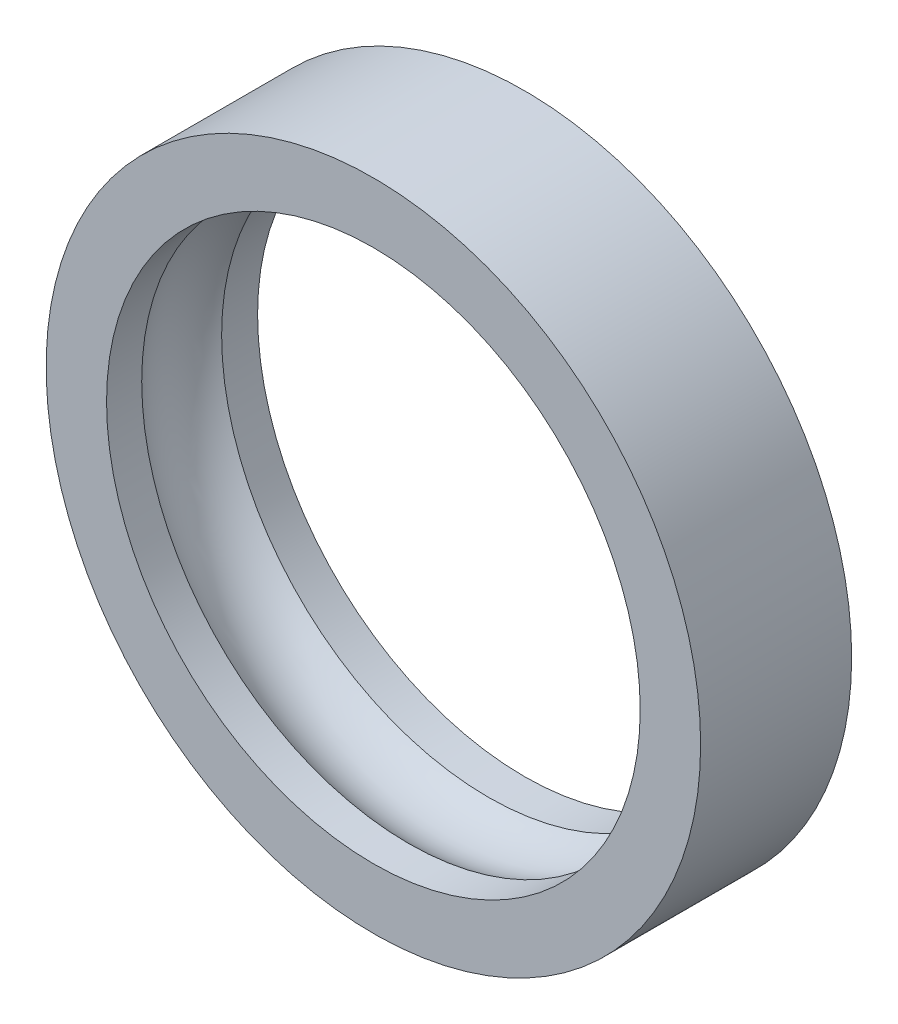
ISO-10303-21;
HEADER;
FILE_DESCRIPTION(('STEP AP214'),'2;1');
FILE_NAME('part.step','',(''),(''),'','','');
FILE_SCHEMA(('AUTOMOTIVE_DESIGN { 1 0 10303 214 1 1 1 1 }'));
ENDSEC;
DATA;
#1=APPLICATION_CONTEXT('core data for automotive mechanical design processes');
#2=APPLICATION_PROTOCOL_DEFINITION('international standard','automotive_design',2000,#1);
#3=PRODUCT_CONTEXT('',#1,'mechanical');
#4=PRODUCT('Part','Part','',(#3));
#5=PRODUCT_RELATED_PRODUCT_CATEGORY('part','',(#4));
#6=PRODUCT_DEFINITION_FORMATION('','',#4);
#7=PRODUCT_DEFINITION_CONTEXT('part definition',#1,'design');
#8=PRODUCT_DEFINITION('design','',#6,#7);
#9=PRODUCT_DEFINITION_SHAPE('','',#8);
#10=(LENGTH_UNIT() NAMED_UNIT(*) SI_UNIT(.MILLI.,.METRE.));
#11=(NAMED_UNIT(*) PLANE_ANGLE_UNIT() SI_UNIT($,.RADIAN.));
#12=(NAMED_UNIT(*) SI_UNIT($,.STERADIAN.) SOLID_ANGLE_UNIT());
#13=UNCERTAINTY_MEASURE_WITH_UNIT(LENGTH_MEASURE(1.E-05),#10,'distance_accuracy_value','');
#14=(GEOMETRIC_REPRESENTATION_CONTEXT(3) GLOBAL_UNCERTAINTY_ASSIGNED_CONTEXT((#13)) GLOBAL_UNIT_ASSIGNED_CONTEXT((#10,
#11,#12)) REPRESENTATION_CONTEXT('',''));
#15=CARTESIAN_POINT('',(0.,0.,0.));
#16=DIRECTION('',(0.,0.,1.));
#17=DIRECTION('',(1.,0.,0.));
#18=AXIS2_PLACEMENT_3D('',#15,#16,#17);
#19=CARTESIAN_POINT('',(0.,53.,15.));
#20=DIRECTION('',(0.,0.,-1.));
#21=DIRECTION('',(-1.,0.,0.));
#22=AXIS2_PLACEMENT_3D('',#19,#20,#21);
#23=PLANE('',#22);
#24=CARTESIAN_POINT('',(0.,0.,15.));
#25=DIRECTION('',(0.,0.,1.));
#26=DIRECTION('',(1.,0.,0.));
#27=AXIS2_PLACEMENT_3D('',#24,#25,#26);
#28=CIRCLE('',#27,53.);
#29=CARTESIAN_POINT('',(53.,0.,15.));
#30=VERTEX_POINT('',#29);
#31=EDGE_CURVE('E10',#30,#30,#28,.T.);
#32=ORIENTED_EDGE('',*,*,#31,.F.);
#33=EDGE_LOOP('',(#32));
#34=FACE_BOUND('',#33,.T.);
#35=CARTESIAN_POINT('',(0.,0.,15.));
#36=DIRECTION('',(0.,0.,1.));
#37=DIRECTION('',(1.,0.,0.));
#38=AXIS2_PLACEMENT_3D('',#35,#36,#37);
#39=CIRCLE('',#38,65.);
#40=CARTESIAN_POINT('',(65.,0.,15.));
#41=VERTEX_POINT('',#40);
#42=EDGE_CURVE('E59',#41,#41,#39,.T.);
#43=ORIENTED_EDGE('',*,*,#42,.T.);
#44=EDGE_LOOP('',(#43));
#45=FACE_BOUND('',#44,.T.);
#46=ADVANCED_FACE('F37',(#34,#45),#23,.F.);
#47=CARTESIAN_POINT('',(0.,0.,0.));
#48=DIRECTION('',(0.,0.,1.));
#49=DIRECTION('',(1.,0.,0.));
#50=AXIS2_PLACEMENT_3D('',#47,#48,#49);
#51=CYLINDRICAL_SURFACE('',#50,53.);
#52=CARTESIAN_POINT('',(0.,0.,8.01855014208431));
#53=DIRECTION('',(0.,0.,1.));
#54=DIRECTION('',(1.,0.,0.));
#55=AXIS2_PLACEMENT_3D('',#52,#53,#54);
#56=CIRCLE('',#55,53.);
#57=CARTESIAN_POINT('',(53.,0.,8.01855014208431));
#58=VERTEX_POINT('',#57);
#59=EDGE_CURVE('E43',#58,#58,#56,.T.);
#60=ORIENTED_EDGE('',*,*,#59,.F.);
#61=EDGE_LOOP('',(#60));
#62=FACE_BOUND('',#61,.T.);
#63=ORIENTED_EDGE('',*,*,#31,.T.);
#64=EDGE_LOOP('',(#63));
#65=FACE_BOUND('',#64,.T.);
#66=ADVANCED_FACE('F84',(#62,#65),#51,.F.);
#67=CARTESIAN_POINT('',(0.,0.,0.0812962088905286));
#68=DIRECTION('',(0.,0.,1.));
#69=DIRECTION('',(1.,0.,0.));
#70=AXIS2_PLACEMENT_3D('',#67,#68,#69);
#71=TOROIDAL_SURFACE('',#70,44.,12.);
#72=CARTESIAN_POINT('',(0.,0.,-7.85595772430325));
#73=DIRECTION('',(0.,0.,1.));
#74=DIRECTION('',(1.,0.,0.));
#75=AXIS2_PLACEMENT_3D('',#72,#73,#74);
#76=CIRCLE('',#75,53.);
#77=CARTESIAN_POINT('',(53.,0.,-7.85595772430325));
#78=VERTEX_POINT('',#77);
#79=EDGE_CURVE('E47',#78,#78,#76,.T.);
#80=ORIENTED_EDGE('',*,*,#79,.F.);
#81=EDGE_LOOP('',(#80));
#82=FACE_BOUND('',#81,.T.);
#83=ORIENTED_EDGE('',*,*,#59,.T.);
#84=EDGE_LOOP('',(#83));
#85=FACE_BOUND('',#84,.T.);
#86=ADVANCED_FACE('F79',(#82,#85),#71,.F.);
#87=CARTESIAN_POINT('',(0.,0.,0.));
#88=DIRECTION('',(0.,0.,1.));
#89=DIRECTION('',(1.,0.,0.));
#90=AXIS2_PLACEMENT_3D('',#87,#88,#89);
#91=CYLINDRICAL_SURFACE('',#90,53.);
#92=CARTESIAN_POINT('',(0.,0.,-15.));
#93=DIRECTION('',(0.,0.,1.));
#94=DIRECTION('',(1.,0.,0.));
#95=AXIS2_PLACEMENT_3D('',#92,#93,#94);
#96=CIRCLE('',#95,53.);
#97=CARTESIAN_POINT('',(53.,0.,-15.));
#98=VERTEX_POINT('',#97);
#99=EDGE_CURVE('E51',#98,#98,#96,.T.);
#100=ORIENTED_EDGE('',*,*,#99,.F.);
#101=EDGE_LOOP('',(#100));
#102=FACE_BOUND('',#101,.T.);
#103=ORIENTED_EDGE('',*,*,#79,.T.);
#104=EDGE_LOOP('',(#103));
#105=FACE_BOUND('',#104,.T.);
#106=ADVANCED_FACE('F73',(#102,#105),#91,.F.);
#107=CARTESIAN_POINT('',(0.,53.,-15.));
#108=DIRECTION('',(0.,0.,1.));
#109=DIRECTION('',(1.,0.,0.));
#110=AXIS2_PLACEMENT_3D('',#107,#108,#109);
#111=PLANE('',#110);
#112=CARTESIAN_POINT('',(0.,0.,-15.));
#113=DIRECTION('',(0.,0.,1.));
#114=DIRECTION('',(1.,0.,0.));
#115=AXIS2_PLACEMENT_3D('',#112,#113,#114);
#116=CIRCLE('',#115,65.);
#117=CARTESIAN_POINT('',(65.,0.,-15.));
#118=VERTEX_POINT('',#117);
#119=EDGE_CURVE('E56',#118,#118,#116,.T.);
#120=ORIENTED_EDGE('',*,*,#119,.F.);
#121=EDGE_LOOP('',(#120));
#122=FACE_BOUND('',#121,.T.);
#123=ORIENTED_EDGE('',*,*,#99,.T.);
#124=EDGE_LOOP('',(#123));
#125=FACE_BOUND('',#124,.T.);
#126=ADVANCED_FACE('F67',(#122,#125),#111,.F.);
#127=CARTESIAN_POINT('',(0.,0.,0.));
#128=DIRECTION('',(0.,0.,1.));
#129=DIRECTION('',(1.,0.,0.));
#130=AXIS2_PLACEMENT_3D('',#127,#128,#129);
#131=CYLINDRICAL_SURFACE('',#130,65.);
#132=ORIENTED_EDGE('',*,*,#42,.F.);
#133=EDGE_LOOP('',(#132));
#134=FACE_BOUND('',#133,.T.);
#135=ORIENTED_EDGE('',*,*,#119,.T.);
#136=EDGE_LOOP('',(#135));
#137=FACE_BOUND('',#136,.T.);
#138=ADVANCED_FACE('F64',(#134,#137),#131,.T.);
#139=CLOSED_SHELL('',(#46,#66,#86,#106,#126,#138));
#140=MANIFOLD_SOLID_BREP('B2',#139);
#141=ADVANCED_BREP_SHAPE_REPRESENTATION('',(#18,#140),#14);
#142=SHAPE_DEFINITION_REPRESENTATION(#9,#141);
ENDSEC;
END-ISO-10303-21;
